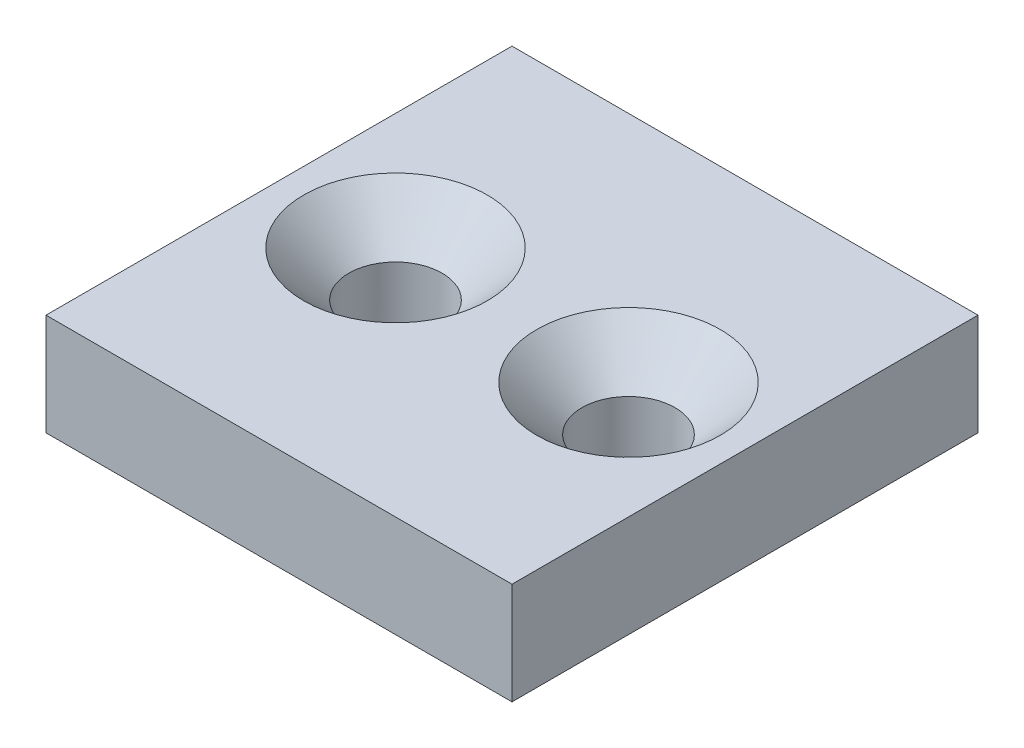
ISO-10303-21;
HEADER;
FILE_DESCRIPTION(('STEP AP214'),'2;1');
FILE_NAME('part.step','',(''),(''),'','','');
FILE_SCHEMA(('AUTOMOTIVE_DESIGN { 1 0 10303 214 1 1 1 1 }'));
ENDSEC;
DATA;
#1=APPLICATION_CONTEXT('core data for automotive mechanical design processes');
#2=APPLICATION_PROTOCOL_DEFINITION('international standard','automotive_design',2000,#1);
#3=PRODUCT_CONTEXT('',#1,'mechanical');
#4=PRODUCT('Part','Part','',(#3));
#5=PRODUCT_RELATED_PRODUCT_CATEGORY('part','',(#4));
#6=PRODUCT_DEFINITION_FORMATION('','',#4);
#7=PRODUCT_DEFINITION_CONTEXT('part definition',#1,'design');
#8=PRODUCT_DEFINITION('design','',#6,#7);
#9=PRODUCT_DEFINITION_SHAPE('','',#8);
#10=(LENGTH_UNIT() NAMED_UNIT(*) SI_UNIT(.MILLI.,.METRE.));
#11=(NAMED_UNIT(*) PLANE_ANGLE_UNIT() SI_UNIT($,.RADIAN.));
#12=(NAMED_UNIT(*) SI_UNIT($,.STERADIAN.) SOLID_ANGLE_UNIT());
#13=UNCERTAINTY_MEASURE_WITH_UNIT(LENGTH_MEASURE(1.E-05),#10,'distance_accuracy_value','');
#14=(GEOMETRIC_REPRESENTATION_CONTEXT(3) GLOBAL_UNCERTAINTY_ASSIGNED_CONTEXT((#13)) GLOBAL_UNIT_ASSIGNED_CONTEXT((#10,
#11,#12)) REPRESENTATION_CONTEXT('',''));
#15=CARTESIAN_POINT('',(0.,0.,0.));
#16=DIRECTION('',(0.,0.,1.));
#17=DIRECTION('',(1.,0.,0.));
#18=AXIS2_PLACEMENT_3D('',#15,#16,#17);
#19=CARTESIAN_POINT('',(0.,7.,0.));
#20=DIRECTION('',(0.,-1.,0.));
#21=DIRECTION('',(0.,0.,-1.));
#22=AXIS2_PLACEMENT_3D('',#19,#20,#21);
#23=PLANE('',#22);
#24=CARTESIAN_POINT('',(8.,7.,0.));
#25=DIRECTION('',(0.,1.,0.));
#26=DIRECTION('',(0.,0.,1.));
#27=AXIS2_PLACEMENT_3D('',#24,#25,#26);
#28=CIRCLE('',#27,6.3);
#29=CARTESIAN_POINT('',(8.,7.,6.3));
#30=VERTEX_POINT('',#29);
#31=EDGE_CURVE('E152',#30,#30,#28,.T.);
#32=ORIENTED_EDGE('',*,*,#31,.F.);
#33=EDGE_LOOP('',(#32));
#34=FACE_BOUND('',#33,.T.);
#35=DIRECTION('',(0.,0.,-1.));
#36=VECTOR('',#35,1.);
#37=CARTESIAN_POINT('',(16.,7.,16.));
#38=LINE('',#37,#36);
#39=CARTESIAN_POINT('',(16.,7.,16.));
#40=VERTEX_POINT('',#39);
#41=CARTESIAN_POINT('',(16.,7.,-16.));
#42=VERTEX_POINT('',#41);
#43=EDGE_CURVE('E96',#40,#42,#38,.T.);
#44=ORIENTED_EDGE('',*,*,#43,.T.);
#45=DIRECTION('',(-1.,0.,0.));
#46=VECTOR('',#45,1.);
#47=CARTESIAN_POINT('',(-16.,7.,-16.));
#48=LINE('',#47,#46);
#49=CARTESIAN_POINT('',(-16.,7.,-16.));
#50=VERTEX_POINT('',#49);
#51=EDGE_CURVE('E91',#42,#50,#48,.T.);
#52=ORIENTED_EDGE('',*,*,#51,.T.);
#53=DIRECTION('',(0.,0.,1.));
#54=VECTOR('',#53,1.);
#55=CARTESIAN_POINT('',(-16.,7.,16.));
#56=LINE('',#55,#54);
#57=CARTESIAN_POINT('',(-16.,7.,16.));
#58=VERTEX_POINT('',#57);
#59=EDGE_CURVE('E94',#50,#58,#56,.T.);
#60=ORIENTED_EDGE('',*,*,#59,.T.);
#61=DIRECTION('',(1.,0.,0.));
#62=VECTOR('',#61,1.);
#63=CARTESIAN_POINT('',(-16.,7.,16.));
#64=LINE('',#63,#62);
#65=EDGE_CURVE('E61',#58,#40,#64,.T.);
#66=ORIENTED_EDGE('',*,*,#65,.T.);
#67=EDGE_LOOP('',(#44,#52,#60,#66));
#68=FACE_BOUND('',#67,.T.);
#69=CARTESIAN_POINT('',(-8.,7.,0.));
#70=DIRECTION('',(0.,1.,0.));
#71=DIRECTION('',(0.,0.,1.));
#72=AXIS2_PLACEMENT_3D('',#69,#70,#71);
#73=CIRCLE('',#72,6.3);
#74=CARTESIAN_POINT('',(-8.,7.,6.3));
#75=VERTEX_POINT('',#74);
#76=EDGE_CURVE('E140',#75,#75,#73,.T.);
#77=ORIENTED_EDGE('',*,*,#76,.F.);
#78=EDGE_LOOP('',(#77));
#79=FACE_BOUND('',#78,.T.);
#80=ADVANCED_FACE('F43',(#34,#68,#79),#23,.F.);
#81=CARTESIAN_POINT('',(16.,7.,16.));
#82=DIRECTION('',(-1.,0.,0.));
#83=DIRECTION('',(0.,0.,1.));
#84=AXIS2_PLACEMENT_3D('',#81,#82,#83);
#85=PLANE('',#84);
#86=DIRECTION('',(0.,0.,-1.));
#87=VECTOR('',#86,1.);
#88=CARTESIAN_POINT('',(16.,0.,16.));
#89=LINE('',#88,#87);
#90=CARTESIAN_POINT('',(16.,0.,16.));
#91=VERTEX_POINT('',#90);
#92=CARTESIAN_POINT('',(16.,0.,-16.));
#93=VERTEX_POINT('',#92);
#94=EDGE_CURVE('E112',#91,#93,#89,.T.);
#95=ORIENTED_EDGE('',*,*,#94,.T.);
#96=DIRECTION('',(0.,-1.,0.));
#97=VECTOR('',#96,1.);
#98=CARTESIAN_POINT('',(16.,7.,-16.));
#99=LINE('',#98,#97);
#100=EDGE_CURVE('E11',#42,#93,#99,.T.);
#101=ORIENTED_EDGE('',*,*,#100,.F.);
#102=ORIENTED_EDGE('',*,*,#43,.F.);
#103=DIRECTION('',(0.,-1.,0.));
#104=VECTOR('',#103,1.);
#105=CARTESIAN_POINT('',(16.,7.,16.));
#106=LINE('',#105,#104);
#107=EDGE_CURVE('E108',#40,#91,#106,.T.);
#108=ORIENTED_EDGE('',*,*,#107,.T.);
#109=EDGE_LOOP('',(#95,#101,#102,#108));
#110=FACE_BOUND('',#109,.T.);
#111=ADVANCED_FACE('F45',(#110),#85,.F.);
#112=CARTESIAN_POINT('',(-16.,7.,-16.));
#113=DIRECTION('',(0.,0.,1.));
#114=DIRECTION('',(1.,0.,0.));
#115=AXIS2_PLACEMENT_3D('',#112,#113,#114);
#116=PLANE('',#115);
#117=DIRECTION('',(-1.,0.,0.));
#118=VECTOR('',#117,1.);
#119=CARTESIAN_POINT('',(-16.,0.,-16.));
#120=LINE('',#119,#118);
#121=CARTESIAN_POINT('',(-16.,0.,-16.));
#122=VERTEX_POINT('',#121);
#123=EDGE_CURVE('E101',#93,#122,#120,.T.);
#124=ORIENTED_EDGE('',*,*,#123,.T.);
#125=DIRECTION('',(0.,-1.,0.));
#126=VECTOR('',#125,1.);
#127=CARTESIAN_POINT('',(-16.,7.,-16.));
#128=LINE('',#127,#126);
#129=EDGE_CURVE('E53',#50,#122,#128,.T.);
#130=ORIENTED_EDGE('',*,*,#129,.F.);
#131=ORIENTED_EDGE('',*,*,#51,.F.);
#132=ORIENTED_EDGE('',*,*,#100,.T.);
#133=EDGE_LOOP('',(#124,#130,#131,#132));
#134=FACE_BOUND('',#133,.T.);
#135=ADVANCED_FACE('F100',(#134),#116,.F.);
#136=CARTESIAN_POINT('',(-16.,7.,16.));
#137=DIRECTION('',(1.,0.,0.));
#138=DIRECTION('',(0.,0.,-1.));
#139=AXIS2_PLACEMENT_3D('',#136,#137,#138);
#140=PLANE('',#139);
#141=DIRECTION('',(0.,0.,1.));
#142=VECTOR('',#141,1.);
#143=CARTESIAN_POINT('',(-16.,0.,16.));
#144=LINE('',#143,#142);
#145=CARTESIAN_POINT('',(-16.,0.,16.));
#146=VERTEX_POINT('',#145);
#147=EDGE_CURVE('E78',#122,#146,#144,.T.);
#148=ORIENTED_EDGE('',*,*,#147,.T.);
#149=DIRECTION('',(0.,-1.,0.));
#150=VECTOR('',#149,1.);
#151=CARTESIAN_POINT('',(-16.,7.,16.));
#152=LINE('',#151,#150);
#153=EDGE_CURVE('E103',#58,#146,#152,.T.);
#154=ORIENTED_EDGE('',*,*,#153,.F.);
#155=ORIENTED_EDGE('',*,*,#59,.F.);
#156=ORIENTED_EDGE('',*,*,#129,.T.);
#157=EDGE_LOOP('',(#148,#154,#155,#156));
#158=FACE_BOUND('',#157,.T.);
#159=ADVANCED_FACE('F104',(#158),#140,.F.);
#160=CARTESIAN_POINT('',(-16.,7.,16.));
#161=DIRECTION('',(0.,0.,-1.));
#162=DIRECTION('',(-1.,0.,0.));
#163=AXIS2_PLACEMENT_3D('',#160,#161,#162);
#164=PLANE('',#163);
#165=DIRECTION('',(1.,0.,0.));
#166=VECTOR('',#165,1.);
#167=CARTESIAN_POINT('',(-16.,0.,16.));
#168=LINE('',#167,#166);
#169=EDGE_CURVE('E84',#146,#91,#168,.T.);
#170=ORIENTED_EDGE('',*,*,#169,.T.);
#171=ORIENTED_EDGE('',*,*,#107,.F.);
#172=ORIENTED_EDGE('',*,*,#65,.F.);
#173=ORIENTED_EDGE('',*,*,#153,.T.);
#174=EDGE_LOOP('',(#170,#171,#172,#173));
#175=FACE_BOUND('',#174,.T.);
#176=ADVANCED_FACE('F126',(#175),#164,.F.);
#177=CARTESIAN_POINT('',(0.,0.,0.));
#178=DIRECTION('',(0.,-1.,0.));
#179=DIRECTION('',(0.,0.,-1.));
#180=AXIS2_PLACEMENT_3D('',#177,#178,#179);
#181=PLANE('',#180);
#182=CARTESIAN_POINT('',(8.,0.,0.));
#183=DIRECTION('',(0.,-1.,0.));
#184=DIRECTION('',(0.,0.,-1.));
#185=AXIS2_PLACEMENT_3D('',#182,#183,#184);
#186=CIRCLE('',#185,3.2);
#187=CARTESIAN_POINT('',(8.,0.,-3.2));
#188=VERTEX_POINT('',#187);
#189=EDGE_CURVE('E144',#188,#188,#186,.T.);
#190=ORIENTED_EDGE('',*,*,#189,.F.);
#191=EDGE_LOOP('',(#190));
#192=FACE_BOUND('',#191,.T.);
#193=CARTESIAN_POINT('',(-8.,0.,0.));
#194=DIRECTION('',(0.,-1.,0.));
#195=DIRECTION('',(0.,0.,-1.));
#196=AXIS2_PLACEMENT_3D('',#193,#194,#195);
#197=CIRCLE('',#196,3.2);
#198=CARTESIAN_POINT('',(-8.,0.,-3.2));
#199=VERTEX_POINT('',#198);
#200=EDGE_CURVE('E116',#199,#199,#197,.T.);
#201=ORIENTED_EDGE('',*,*,#200,.F.);
#202=EDGE_LOOP('',(#201));
#203=FACE_BOUND('',#202,.T.);
#204=ORIENTED_EDGE('',*,*,#94,.F.);
#205=ORIENTED_EDGE('',*,*,#169,.F.);
#206=ORIENTED_EDGE('',*,*,#147,.F.);
#207=ORIENTED_EDGE('',*,*,#123,.F.);
#208=EDGE_LOOP('',(#204,#205,#206,#207));
#209=FACE_BOUND('',#208,.T.);
#210=ADVANCED_FACE('F129',(#192,#203,#209),#181,.T.);
#211=CARTESIAN_POINT('',(-8.,7.,0.));
#212=DIRECTION('',(0.,1.,0.));
#213=DIRECTION('',(0.,0.,1.));
#214=AXIS2_PLACEMENT_3D('',#211,#212,#213);
#215=CYLINDRICAL_SURFACE('',#214,3.2);
#216=CARTESIAN_POINT('',(-8.,3.9,0.));
#217=DIRECTION('',(0.,1.,0.));
#218=DIRECTION('',(0.,0.,1.));
#219=AXIS2_PLACEMENT_3D('',#216,#217,#218);
#220=CIRCLE('',#219,3.2);
#221=CARTESIAN_POINT('',(-8.,3.9,3.2));
#222=VERTEX_POINT('',#221);
#223=EDGE_CURVE('E136',#222,#222,#220,.T.);
#224=ORIENTED_EDGE('',*,*,#223,.T.);
#225=EDGE_LOOP('',(#224));
#226=FACE_BOUND('',#225,.T.);
#227=ORIENTED_EDGE('',*,*,#200,.T.);
#228=EDGE_LOOP('',(#227));
#229=FACE_BOUND('',#228,.T.);
#230=ADVANCED_FACE('F166',(#226,#229),#215,.F.);
#231=CARTESIAN_POINT('',(-8.,7.,0.));
#232=DIRECTION('',(0.,1.,0.));
#233=DIRECTION('',(0.,0.,1.));
#234=AXIS2_PLACEMENT_3D('',#231,#232,#233);
#235=CONICAL_SURFACE('',#234,6.3,0.785398163397448);
#236=ORIENTED_EDGE('',*,*,#223,.F.);
#237=EDGE_LOOP('',(#236));
#238=FACE_BOUND('',#237,.T.);
#239=ORIENTED_EDGE('',*,*,#76,.T.);
#240=EDGE_LOOP('',(#239));
#241=FACE_BOUND('',#240,.T.);
#242=ADVANCED_FACE('F197',(#238,#241),#235,.F.);
#243=CARTESIAN_POINT('',(8.,7.,0.));
#244=DIRECTION('',(0.,1.,0.));
#245=DIRECTION('',(0.,0.,1.));
#246=AXIS2_PLACEMENT_3D('',#243,#244,#245);
#247=CYLINDRICAL_SURFACE('',#246,3.2);
#248=CARTESIAN_POINT('',(8.,3.9,0.));
#249=DIRECTION('',(0.,1.,0.));
#250=DIRECTION('',(0.,0.,1.));
#251=AXIS2_PLACEMENT_3D('',#248,#249,#250);
#252=CIRCLE('',#251,3.2);
#253=CARTESIAN_POINT('',(8.,3.9,3.2));
#254=VERTEX_POINT('',#253);
#255=EDGE_CURVE('E148',#254,#254,#252,.T.);
#256=ORIENTED_EDGE('',*,*,#255,.T.);
#257=EDGE_LOOP('',(#256));
#258=FACE_BOUND('',#257,.T.);
#259=ORIENTED_EDGE('',*,*,#189,.T.);
#260=EDGE_LOOP('',(#259));
#261=FACE_BOUND('',#260,.T.);
#262=ADVANCED_FACE('F204',(#258,#261),#247,.F.);
#263=CARTESIAN_POINT('',(8.,7.,0.));
#264=DIRECTION('',(0.,1.,0.));
#265=DIRECTION('',(0.,0.,1.));
#266=AXIS2_PLACEMENT_3D('',#263,#264,#265);
#267=CONICAL_SURFACE('',#266,6.3,0.785398163397448);
#268=ORIENTED_EDGE('',*,*,#255,.F.);
#269=EDGE_LOOP('',(#268));
#270=FACE_BOUND('',#269,.T.);
#271=ORIENTED_EDGE('',*,*,#31,.T.);
#272=EDGE_LOOP('',(#271));
#273=FACE_BOUND('',#272,.T.);
#274=ADVANCED_FACE('F157',(#270,#273),#267,.F.);
#275=CLOSED_SHELL('',(#80,#111,#135,#159,#176,#210,#230,#242,#262,#274));
#276=MANIFOLD_SOLID_BREP('B2',#275);
#277=ADVANCED_BREP_SHAPE_REPRESENTATION('',(#18,#276),#14);
#278=SHAPE_DEFINITION_REPRESENTATION(#9,#277);
ENDSEC;
END-ISO-10303-21;
